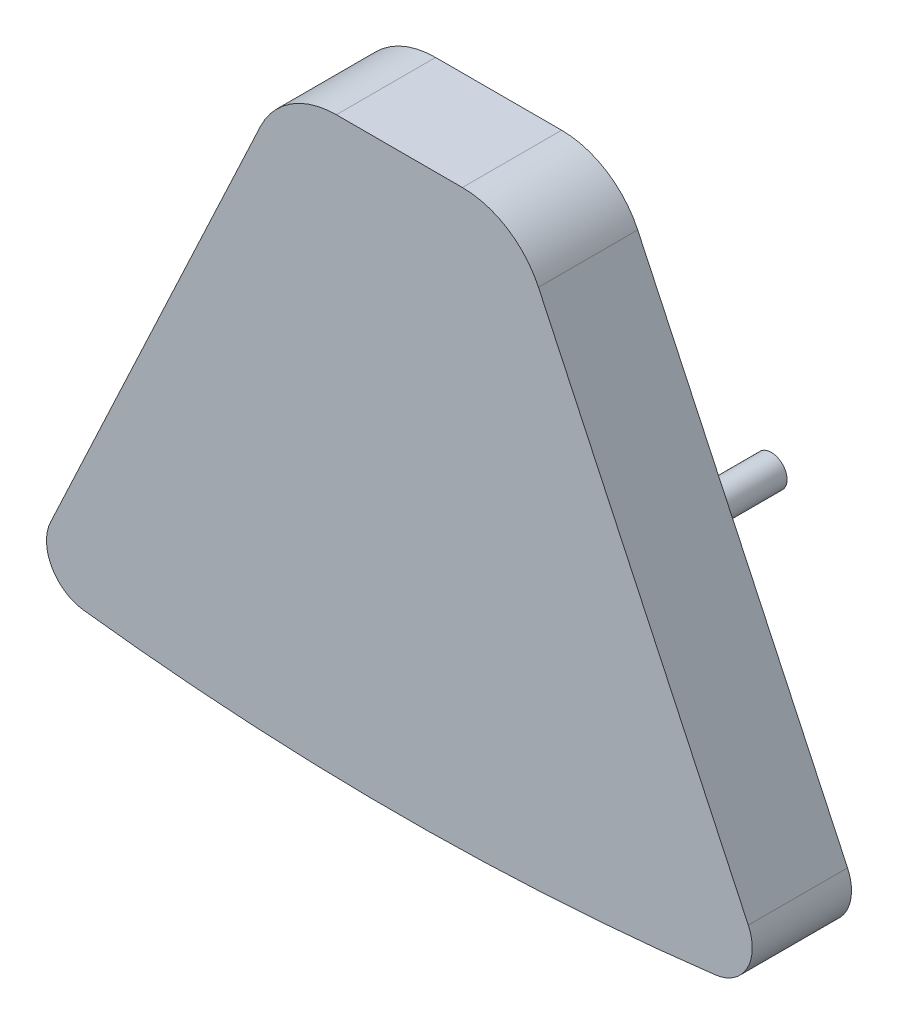
ISO-10303-21;
HEADER;
FILE_DESCRIPTION(('STEP AP214'),'2;1');
FILE_NAME('part.step','',(''),(''),'','','');
FILE_SCHEMA(('AUTOMOTIVE_DESIGN { 1 0 10303 214 1 1 1 1 }'));
ENDSEC;
DATA;
#1=APPLICATION_CONTEXT('core data for automotive mechanical design processes');
#2=APPLICATION_PROTOCOL_DEFINITION('international standard','automotive_design',2000,#1);
#3=PRODUCT_CONTEXT('',#1,'mechanical');
#4=PRODUCT('Part','Part','',(#3));
#5=PRODUCT_RELATED_PRODUCT_CATEGORY('part','',(#4));
#6=PRODUCT_DEFINITION_FORMATION('','',#4);
#7=PRODUCT_DEFINITION_CONTEXT('part definition',#1,'design');
#8=PRODUCT_DEFINITION('design','',#6,#7);
#9=PRODUCT_DEFINITION_SHAPE('','',#8);
#10=(LENGTH_UNIT() NAMED_UNIT(*) SI_UNIT(.MILLI.,.METRE.));
#11=(NAMED_UNIT(*) PLANE_ANGLE_UNIT() SI_UNIT($,.RADIAN.));
#12=(NAMED_UNIT(*) SI_UNIT($,.STERADIAN.) SOLID_ANGLE_UNIT());
#13=UNCERTAINTY_MEASURE_WITH_UNIT(LENGTH_MEASURE(1.E-05),#10,'distance_accuracy_value','');
#14=(GEOMETRIC_REPRESENTATION_CONTEXT(3) GLOBAL_UNCERTAINTY_ASSIGNED_CONTEXT((#13)) GLOBAL_UNIT_ASSIGNED_CONTEXT((#10,
#11,#12)) REPRESENTATION_CONTEXT('',''));
#15=CARTESIAN_POINT('',(0.,0.,0.));
#16=DIRECTION('',(0.,0.,1.));
#17=DIRECTION('',(1.,0.,0.));
#18=AXIS2_PLACEMENT_3D('',#15,#16,#17);
#19=CARTESIAN_POINT('',(46.99,9.22044604958261,15.));
#20=DIRECTION('',(0.,0.,-1.));
#21=DIRECTION('',(-1.,0.,0.));
#22=AXIS2_PLACEMENT_3D('',#19,#20,#21);
#23=CYLINDRICAL_SURFACE('',#22,6.34999999999968);
#24=CARTESIAN_POINT('',(46.99,9.22044604958261,0.));
#25=DIRECTION('',(0.,0.,-1.));
#26=DIRECTION('',(-1.,0.,0.));
#27=AXIS2_PLACEMENT_3D('',#24,#25,#26);
#28=CIRCLE('',#27,6.34999999999968);
#29=CARTESIAN_POINT('',(52.7394089137371,11.9161457996736,0.));
#30=VERTEX_POINT('',#29);
#31=CARTESIAN_POINT('',(47.7629120787005,2.91766040206209,0.));
#32=VERTEX_POINT('',#31);
#33=EDGE_CURVE('E143',#30,#32,#28,.T.);
#34=ORIENTED_EDGE('',*,*,#33,.F.);
#35=DIRECTION('',(0.,0.,-1.));
#36=VECTOR('',#35,1.);
#37=CARTESIAN_POINT('',(52.7394089137371,11.9161457996736,15.));
#38=LINE('',#37,#36);
#39=CARTESIAN_POINT('',(52.7394089137371,11.9161457996736,15.));
#40=VERTEX_POINT('',#39);
#41=EDGE_CURVE('E11',#40,#30,#38,.T.);
#42=ORIENTED_EDGE('',*,*,#41,.F.);
#43=CARTESIAN_POINT('',(46.99,9.22044604958261,15.));
#44=DIRECTION('',(0.,0.,-1.));
#45=DIRECTION('',(-1.,0.,0.));
#46=AXIS2_PLACEMENT_3D('',#43,#44,#45);
#47=CIRCLE('',#46,6.34999999999968);
#48=CARTESIAN_POINT('',(47.7629120787005,2.91766040206209,15.));
#49=VERTEX_POINT('',#48);
#50=EDGE_CURVE('E161',#40,#49,#47,.T.);
#51=ORIENTED_EDGE('',*,*,#50,.T.);
#52=DIRECTION('',(0.,0.,-1.));
#53=VECTOR('',#52,1.);
#54=CARTESIAN_POINT('',(47.7629120787005,2.91766040206209,15.));
#55=LINE('',#54,#53);
#56=EDGE_CURVE('E48',#49,#32,#55,.T.);
#57=ORIENTED_EDGE('',*,*,#56,.T.);
#58=EDGE_LOOP('',(#34,#42,#51,#57));
#59=FACE_BOUND('',#58,.T.);
#60=ADVANCED_FACE('F45',(#59),#23,.T.);
#61=CARTESIAN_POINT('',(52.7394089137371,11.9161457996736,15.));
#62=DIRECTION('',(-0.90541872657277,-0.424519645683617,0.));
#63=DIRECTION('',(0.424519645683617,-0.90541872657277,0.));
#64=AXIS2_PLACEMENT_3D('',#61,#62,#63);
#65=PLANE('',#64);
#66=DIRECTION('',(-0.424519645683617,0.90541872657277,0.));
#67=VECTOR('',#66,1.);
#68=CARTESIAN_POINT('',(52.7394089137371,11.9161457996736,0.));
#69=LINE('',#68,#67);
#70=CARTESIAN_POINT('',(21.0238178274742,79.5593995001819,0.));
#71=VERTEX_POINT('',#70);
#72=EDGE_CURVE('E90',#30,#71,#69,.T.);
#73=ORIENTED_EDGE('',*,*,#72,.T.);
#74=DIRECTION('',(0.,0.,-1.));
#75=VECTOR('',#74,1.);
#76=CARTESIAN_POINT('',(21.0238178274742,79.5593995001819,15.));
#77=LINE('',#76,#75);
#78=CARTESIAN_POINT('',(21.0238178274742,79.5593995001819,15.));
#79=VERTEX_POINT('',#78);
#80=EDGE_CURVE('E54',#79,#71,#77,.T.);
#81=ORIENTED_EDGE('',*,*,#80,.F.);
#82=DIRECTION('',(-0.424519645683617,0.90541872657277,0.));
#83=VECTOR('',#82,1.);
#84=CARTESIAN_POINT('',(52.7394089137371,11.9161457996736,15.));
#85=LINE('',#84,#83);
#86=EDGE_CURVE('E122',#40,#79,#85,.T.);
#87=ORIENTED_EDGE('',*,*,#86,.F.);
#88=ORIENTED_EDGE('',*,*,#41,.T.);
#89=EDGE_LOOP('',(#73,#81,#87,#88));
#90=FACE_BOUND('',#89,.T.);
#91=ADVANCED_FACE('F223',(#90),#65,.F.);
#92=CARTESIAN_POINT('',(9.525,74.168,15.));
#93=DIRECTION('',(0.,0.,-1.));
#94=DIRECTION('',(-1.,0.,0.));
#95=AXIS2_PLACEMENT_3D('',#92,#93,#94);
#96=CYLINDRICAL_SURFACE('',#95,12.7);
#97=CARTESIAN_POINT('',(9.525,74.168,0.));
#98=DIRECTION('',(0.,0.,1.));
#99=DIRECTION('',(1.,0.,0.));
#100=AXIS2_PLACEMENT_3D('',#97,#98,#99);
#101=CIRCLE('',#100,12.7);
#102=CARTESIAN_POINT('',(9.525,86.868,0.));
#103=VERTEX_POINT('',#102);
#104=EDGE_CURVE('E129',#71,#103,#101,.T.);
#105=ORIENTED_EDGE('',*,*,#104,.T.);
#106=DIRECTION('',(0.,0.,-1.));
#107=VECTOR('',#106,1.);
#108=CARTESIAN_POINT('',(9.525,86.868,15.));
#109=LINE('',#108,#107);
#110=CARTESIAN_POINT('',(9.525,86.868,15.));
#111=VERTEX_POINT('',#110);
#112=EDGE_CURVE('E126',#111,#103,#109,.T.);
#113=ORIENTED_EDGE('',*,*,#112,.F.);
#114=CARTESIAN_POINT('',(9.525,74.168,15.));
#115=DIRECTION('',(0.,0.,1.));
#116=DIRECTION('',(1.,0.,0.));
#117=AXIS2_PLACEMENT_3D('',#114,#115,#116);
#118=CIRCLE('',#117,12.7);
#119=EDGE_CURVE('E115',#79,#111,#118,.T.);
#120=ORIENTED_EDGE('',*,*,#119,.F.);
#121=ORIENTED_EDGE('',*,*,#80,.T.);
#122=EDGE_LOOP('',(#105,#113,#120,#121));
#123=FACE_BOUND('',#122,.T.);
#124=ADVANCED_FACE('F127',(#123),#96,.T.);
#125=CARTESIAN_POINT('',(-9.525,86.868,15.));
#126=DIRECTION('',(0.,1.,0.));
#127=DIRECTION('',(0.,0.,1.));
#128=AXIS2_PLACEMENT_3D('',#125,#126,#127);
#129=PLANE('',#128);
#130=DIRECTION('',(1.,0.,0.));
#131=VECTOR('',#130,1.);
#132=CARTESIAN_POINT('',(-9.525,86.868,0.));
#133=LINE('',#132,#131);
#134=CARTESIAN_POINT('',(-9.525,86.868,0.));
#135=VERTEX_POINT('',#134);
#136=EDGE_CURVE('E158',#135,#103,#133,.T.);
#137=ORIENTED_EDGE('',*,*,#136,.F.);
#138=DIRECTION('',(0.,0.,-1.));
#139=VECTOR('',#138,1.);
#140=CARTESIAN_POINT('',(-9.525,86.868,15.));
#141=LINE('',#140,#139);
#142=CARTESIAN_POINT('',(-9.525,86.868,15.));
#143=VERTEX_POINT('',#142);
#144=EDGE_CURVE('E133',#143,#135,#141,.T.);
#145=ORIENTED_EDGE('',*,*,#144,.F.);
#146=DIRECTION('',(1.,0.,0.));
#147=VECTOR('',#146,1.);
#148=CARTESIAN_POINT('',(-9.525,86.868,15.));
#149=LINE('',#148,#147);
#150=EDGE_CURVE('E120',#143,#111,#149,.T.);
#151=ORIENTED_EDGE('',*,*,#150,.T.);
#152=ORIENTED_EDGE('',*,*,#112,.T.);
#153=EDGE_LOOP('',(#137,#145,#151,#152));
#154=FACE_BOUND('',#153,.T.);
#155=ADVANCED_FACE('F135',(#154),#129,.T.);
#156=CARTESIAN_POINT('',(-9.525,74.168,15.));
#157=DIRECTION('',(0.,0.,-1.));
#158=DIRECTION('',(-1.,0.,0.));
#159=AXIS2_PLACEMENT_3D('',#156,#157,#158);
#160=CYLINDRICAL_SURFACE('',#159,12.7);
#161=CARTESIAN_POINT('',(-9.525,74.168,0.));
#162=DIRECTION('',(0.,0.,-1.));
#163=DIRECTION('',(-1.,0.,0.));
#164=AXIS2_PLACEMENT_3D('',#161,#162,#163);
#165=CIRCLE('',#164,12.7);
#166=CARTESIAN_POINT('',(-21.0238178274742,79.5593995001819,0.));
#167=VERTEX_POINT('',#166);
#168=EDGE_CURVE('E155',#167,#135,#165,.T.);
#169=ORIENTED_EDGE('',*,*,#168,.F.);
#170=DIRECTION('',(0.,0.,-1.));
#171=VECTOR('',#170,1.);
#172=CARTESIAN_POINT('',(-21.0238178274742,79.5593995001819,15.));
#173=LINE('',#172,#171);
#174=CARTESIAN_POINT('',(-21.0238178274742,79.5593995001819,15.));
#175=VERTEX_POINT('',#174);
#176=EDGE_CURVE('E165',#175,#167,#173,.T.);
#177=ORIENTED_EDGE('',*,*,#176,.F.);
#178=CARTESIAN_POINT('',(-9.525,74.168,15.));
#179=DIRECTION('',(0.,0.,-1.));
#180=DIRECTION('',(-1.,0.,0.));
#181=AXIS2_PLACEMENT_3D('',#178,#179,#180);
#182=CIRCLE('',#181,12.7);
#183=EDGE_CURVE('E136',#175,#143,#182,.T.);
#184=ORIENTED_EDGE('',*,*,#183,.T.);
#185=ORIENTED_EDGE('',*,*,#144,.T.);
#186=EDGE_LOOP('',(#169,#177,#184,#185));
#187=FACE_BOUND('',#186,.T.);
#188=ADVANCED_FACE('F180',(#187),#160,.T.);
#189=CARTESIAN_POINT('',(-52.7394089137371,11.9161457996736,15.));
#190=DIRECTION('',(-0.90541872657277,0.424519645683617,0.));
#191=DIRECTION('',(-0.424519645683617,-0.90541872657277,0.));
#192=AXIS2_PLACEMENT_3D('',#189,#190,#191);
#193=PLANE('',#192);
#194=DIRECTION('',(0.424519645683617,0.90541872657277,0.));
#195=VECTOR('',#194,1.);
#196=CARTESIAN_POINT('',(-52.7394089137371,11.9161457996736,0.));
#197=LINE('',#196,#195);
#198=CARTESIAN_POINT('',(-52.7394089137371,11.9161457996736,0.));
#199=VERTEX_POINT('',#198);
#200=EDGE_CURVE('E152',#199,#167,#197,.T.);
#201=ORIENTED_EDGE('',*,*,#200,.F.);
#202=DIRECTION('',(0.,0.,-1.));
#203=VECTOR('',#202,1.);
#204=CARTESIAN_POINT('',(-52.7394089137371,11.9161457996736,15.));
#205=LINE('',#204,#203);
#206=CARTESIAN_POINT('',(-52.7394089137371,11.9161457996736,15.));
#207=VERTEX_POINT('',#206);
#208=EDGE_CURVE('E167',#207,#199,#205,.T.);
#209=ORIENTED_EDGE('',*,*,#208,.F.);
#210=DIRECTION('',(0.424519645683617,0.90541872657277,0.));
#211=VECTOR('',#210,1.);
#212=CARTESIAN_POINT('',(-52.7394089137371,11.9161457996736,15.));
#213=LINE('',#212,#211);
#214=EDGE_CURVE('E138',#207,#175,#213,.T.);
#215=ORIENTED_EDGE('',*,*,#214,.T.);
#216=ORIENTED_EDGE('',*,*,#176,.T.);
#217=EDGE_LOOP('',(#201,#209,#215,#216));
#218=FACE_BOUND('',#217,.T.);
#219=ADVANCED_FACE('F184',(#218),#193,.T.);
#220=CARTESIAN_POINT('',(-46.99,9.22044604958261,15.));
#221=DIRECTION('',(0.,0.,-1.));
#222=DIRECTION('',(-1.,0.,0.));
#223=AXIS2_PLACEMENT_3D('',#220,#221,#222);
#224=CYLINDRICAL_SURFACE('',#223,6.34999999999968);
#225=CARTESIAN_POINT('',(-46.99,9.22044604958261,0.));
#226=DIRECTION('',(0.,0.,1.));
#227=DIRECTION('',(1.,0.,0.));
#228=AXIS2_PLACEMENT_3D('',#225,#226,#227);
#229=CIRCLE('',#228,6.34999999999968);
#230=CARTESIAN_POINT('',(-47.7629120787007,2.91766040206179,0.));
#231=VERTEX_POINT('',#230);
#232=EDGE_CURVE('E150',#199,#231,#229,.T.);
#233=ORIENTED_EDGE('',*,*,#232,.T.);
#234=DIRECTION('',(0.,0.,-1.));
#235=VECTOR('',#234,1.);
#236=CARTESIAN_POINT('',(-47.7629120787007,2.91766040206179,15.));
#237=LINE('',#236,#235);
#238=CARTESIAN_POINT('',(-47.7629120787007,2.91766040206179,15.));
#239=VERTEX_POINT('',#238);
#240=EDGE_CURVE('E168',#239,#231,#237,.T.);
#241=ORIENTED_EDGE('',*,*,#240,.F.);
#242=CARTESIAN_POINT('',(-46.99,9.22044604958261,15.));
#243=DIRECTION('',(0.,0.,1.));
#244=DIRECTION('',(1.,0.,0.));
#245=AXIS2_PLACEMENT_3D('',#242,#243,#244);
#246=CIRCLE('',#245,6.34999999999968);
#247=EDGE_CURVE('E186',#207,#239,#246,.T.);
#248=ORIENTED_EDGE('',*,*,#247,.F.);
#249=ORIENTED_EDGE('',*,*,#208,.T.);
#250=EDGE_LOOP('',(#233,#241,#248,#249));
#251=FACE_BOUND('',#250,.T.);
#252=ADVANCED_FACE('F239',(#251),#224,.T.);
#253=CARTESIAN_POINT('',(0.,392.404906143493,15.));
#254=DIRECTION('',(0.,0.,-1.));
#255=DIRECTION('',(-1.,0.,0.));
#256=AXIS2_PLACEMENT_3D('',#253,#254,#255);
#257=CYLINDRICAL_SURFACE('',#256,392.404906143493);
#258=CARTESIAN_POINT('',(0.,392.404906143493,0.));
#259=DIRECTION('',(0.,0.,1.));
#260=DIRECTION('',(1.,0.,0.));
#261=AXIS2_PLACEMENT_3D('',#258,#259,#260);
#262=CIRCLE('',#261,392.404906143493);
#263=EDGE_CURVE('E146',#231,#32,#262,.T.);
#264=ORIENTED_EDGE('',*,*,#263,.T.);
#265=ORIENTED_EDGE('',*,*,#56,.F.);
#266=CARTESIAN_POINT('',(0.,392.404906143493,15.));
#267=DIRECTION('',(0.,0.,1.));
#268=DIRECTION('',(1.,0.,0.));
#269=AXIS2_PLACEMENT_3D('',#266,#267,#268);
#270=CIRCLE('',#269,392.404906143493);
#271=EDGE_CURVE('E100',#239,#49,#270,.T.);
#272=ORIENTED_EDGE('',*,*,#271,.F.);
#273=ORIENTED_EDGE('',*,*,#240,.T.);
#274=EDGE_LOOP('',(#264,#265,#272,#273));
#275=FACE_BOUND('',#274,.T.);
#276=ADVANCED_FACE('F173',(#275),#257,.T.);
#277=CARTESIAN_POINT('',(46.99,9.22044604958261,15.));
#278=DIRECTION('',(0.,0.,-1.));
#279=DIRECTION('',(-1.,0.,0.));
#280=AXIS2_PLACEMENT_3D('',#277,#278,#279);
#281=PLANE('',#280);
#282=ORIENTED_EDGE('',*,*,#50,.F.);
#283=ORIENTED_EDGE('',*,*,#86,.T.);
#284=ORIENTED_EDGE('',*,*,#119,.T.);
#285=ORIENTED_EDGE('',*,*,#150,.F.);
#286=ORIENTED_EDGE('',*,*,#183,.F.);
#287=ORIENTED_EDGE('',*,*,#214,.F.);
#288=ORIENTED_EDGE('',*,*,#247,.T.);
#289=ORIENTED_EDGE('',*,*,#271,.T.);
#290=EDGE_LOOP('',(#282,#283,#284,#285,#286,#287,#288,#289));
#291=FACE_BOUND('',#290,.T.);
#292=ADVANCED_FACE('F117',(#291),#281,.F.);
#293=CARTESIAN_POINT('',(46.99,9.22044604958261,0.));
#294=DIRECTION('',(0.,0.,-1.));
#295=DIRECTION('',(-1.,0.,0.));
#296=AXIS2_PLACEMENT_3D('',#293,#294,#295);
#297=PLANE('',#296);
#298=CARTESIAN_POINT('',(-27.5,44.45,0.));
#299=DIRECTION('',(0.,0.,-1.));
#300=DIRECTION('',(-1.,0.,0.));
#301=AXIS2_PLACEMENT_3D('',#298,#299,#300);
#302=CIRCLE('',#301,2.38125);
#303=CARTESIAN_POINT('',(-29.88125,44.45,0.));
#304=VERTEX_POINT('',#303);
#305=EDGE_CURVE('E194',#304,#304,#302,.T.);
#306=ORIENTED_EDGE('',*,*,#305,.F.);
#307=EDGE_LOOP('',(#306));
#308=FACE_BOUND('',#307,.T.);
#309=CARTESIAN_POINT('',(27.5,44.45,0.));
#310=DIRECTION('',(0.,0.,-1.));
#311=DIRECTION('',(-1.,0.,0.));
#312=AXIS2_PLACEMENT_3D('',#309,#310,#311);
#313=CIRCLE('',#312,2.38125);
#314=CARTESIAN_POINT('',(25.11875,44.45,0.));
#315=VERTEX_POINT('',#314);
#316=EDGE_CURVE('E191',#315,#315,#313,.T.);
#317=ORIENTED_EDGE('',*,*,#316,.F.);
#318=EDGE_LOOP('',(#317));
#319=FACE_BOUND('',#318,.T.);
#320=ORIENTED_EDGE('',*,*,#33,.T.);
#321=ORIENTED_EDGE('',*,*,#263,.F.);
#322=ORIENTED_EDGE('',*,*,#232,.F.);
#323=ORIENTED_EDGE('',*,*,#200,.T.);
#324=ORIENTED_EDGE('',*,*,#168,.T.);
#325=ORIENTED_EDGE('',*,*,#136,.T.);
#326=ORIENTED_EDGE('',*,*,#104,.F.);
#327=ORIENTED_EDGE('',*,*,#72,.F.);
#328=EDGE_LOOP('',(#320,#321,#322,#323,#324,#325,#326,#327));
#329=FACE_BOUND('',#328,.T.);
#330=ADVANCED_FACE('F176',(#308,#319,#329),#297,.T.);
#331=CARTESIAN_POINT('',(27.5,44.45,-13.716));
#332=DIRECTION('',(0.,0.,1.));
#333=DIRECTION('',(1.,0.,0.));
#334=AXIS2_PLACEMENT_3D('',#331,#332,#333);
#335=CYLINDRICAL_SURFACE('',#334,2.38125);
#336=CARTESIAN_POINT('',(27.5,44.45,-13.716));
#337=DIRECTION('',(0.,0.,-1.));
#338=DIRECTION('',(-1.,0.,0.));
#339=AXIS2_PLACEMENT_3D('',#336,#337,#338);
#340=CIRCLE('',#339,2.38125);
#341=CARTESIAN_POINT('',(25.11875,44.45,-13.716));
#342=VERTEX_POINT('',#341);
#343=EDGE_CURVE('E147',#342,#342,#340,.T.);
#344=ORIENTED_EDGE('',*,*,#343,.F.);
#345=EDGE_LOOP('',(#344));
#346=FACE_BOUND('',#345,.T.);
#347=ORIENTED_EDGE('',*,*,#316,.T.);
#348=EDGE_LOOP('',(#347));
#349=FACE_BOUND('',#348,.T.);
#350=ADVANCED_FACE('F207',(#346,#349),#335,.T.);
#351=CARTESIAN_POINT('',(27.5,44.45,-13.716));
#352=DIRECTION('',(0.,0.,-1.));
#353=DIRECTION('',(-1.,0.,0.));
#354=AXIS2_PLACEMENT_3D('',#351,#352,#353);
#355=PLANE('',#354);
#356=ORIENTED_EDGE('',*,*,#343,.T.);
#357=EDGE_LOOP('',(#356));
#358=FACE_BOUND('',#357,.T.);
#359=ADVANCED_FACE('F212',(#358),#355,.T.);
#360=CARTESIAN_POINT('',(-27.5,44.45,-13.716));
#361=DIRECTION('',(0.,0.,1.));
#362=DIRECTION('',(1.,0.,0.));
#363=AXIS2_PLACEMENT_3D('',#360,#361,#362);
#364=CYLINDRICAL_SURFACE('',#363,2.38125);
#365=CARTESIAN_POINT('',(-27.5,44.45,-13.716));
#366=DIRECTION('',(0.,0.,-1.));
#367=DIRECTION('',(-1.,0.,0.));
#368=AXIS2_PLACEMENT_3D('',#365,#366,#367);
#369=CIRCLE('',#368,2.38125);
#370=CARTESIAN_POINT('',(-29.88125,44.45,-13.716));
#371=VERTEX_POINT('',#370);
#372=EDGE_CURVE('E197',#371,#371,#369,.T.);
#373=ORIENTED_EDGE('',*,*,#372,.F.);
#374=EDGE_LOOP('',(#373));
#375=FACE_BOUND('',#374,.T.);
#376=ORIENTED_EDGE('',*,*,#305,.T.);
#377=EDGE_LOOP('',(#376));
#378=FACE_BOUND('',#377,.T.);
#379=ADVANCED_FACE('F203',(#375,#378),#364,.T.);
#380=CARTESIAN_POINT('',(-27.5,44.45,-13.716));
#381=DIRECTION('',(0.,0.,-1.));
#382=DIRECTION('',(-1.,0.,0.));
#383=AXIS2_PLACEMENT_3D('',#380,#381,#382);
#384=PLANE('',#383);
#385=ORIENTED_EDGE('',*,*,#372,.T.);
#386=EDGE_LOOP('',(#385));
#387=FACE_BOUND('',#386,.T.);
#388=ADVANCED_FACE('F279',(#387),#384,.T.);
#389=CLOSED_SHELL('',(#60,#91,#124,#155,#188,#219,#252,#276,#292,#330,#350,#359,#379,#388));
#390=MANIFOLD_SOLID_BREP('B2',#389);
#391=ADVANCED_BREP_SHAPE_REPRESENTATION('',(#18,#390),#14);
#392=SHAPE_DEFINITION_REPRESENTATION(#9,#391);
ENDSEC;
END-ISO-10303-21;
